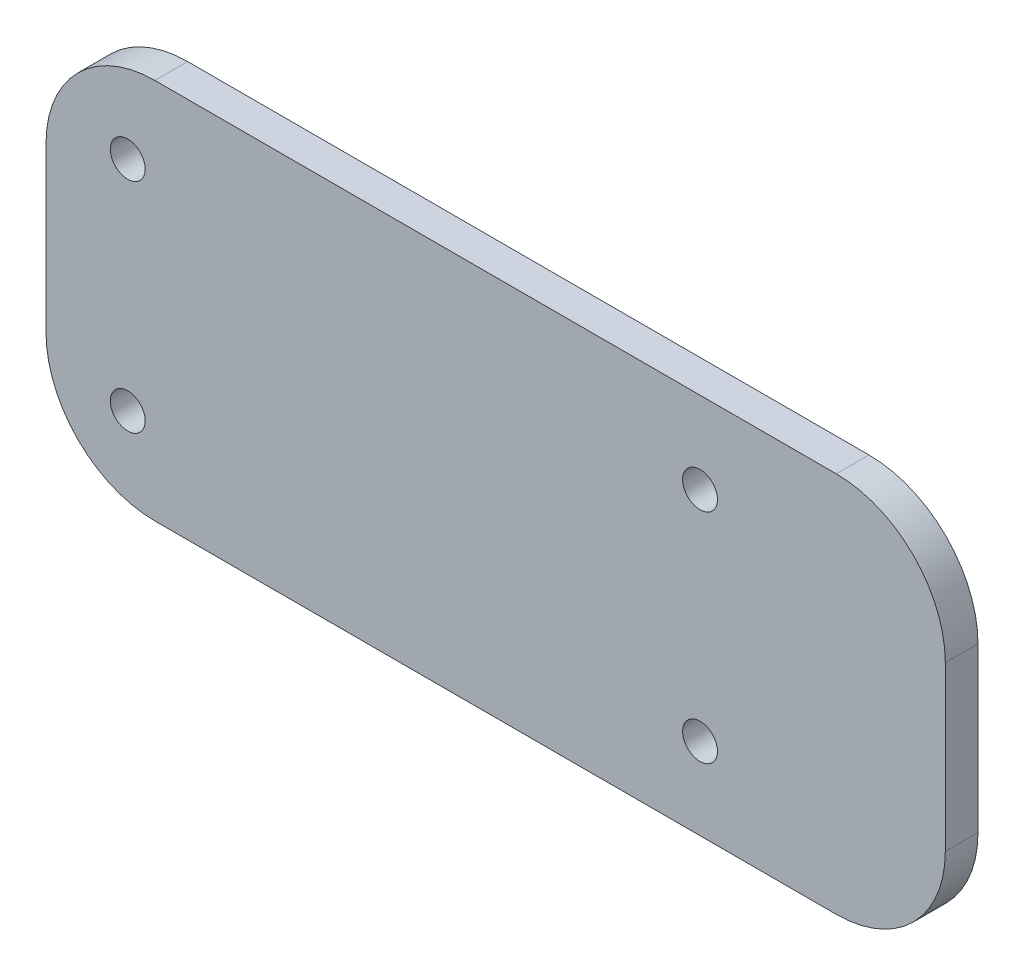
ISO-10303-21;
HEADER;
FILE_DESCRIPTION(('STEP AP214'),'2;1');
FILE_NAME('part.step','',(''),(''),'','','');
FILE_SCHEMA(('AUTOMOTIVE_DESIGN { 1 0 10303 214 1 1 1 1 }'));
ENDSEC;
DATA;
#1=APPLICATION_CONTEXT('core data for automotive mechanical design processes');
#2=APPLICATION_PROTOCOL_DEFINITION('international standard','automotive_design',2000,#1);
#3=PRODUCT_CONTEXT('',#1,'mechanical');
#4=PRODUCT('Part','Part','',(#3));
#5=PRODUCT_RELATED_PRODUCT_CATEGORY('part','',(#4));
#6=PRODUCT_DEFINITION_FORMATION('','',#4);
#7=PRODUCT_DEFINITION_CONTEXT('part definition',#1,'design');
#8=PRODUCT_DEFINITION('design','',#6,#7);
#9=PRODUCT_DEFINITION_SHAPE('','',#8);
#10=(LENGTH_UNIT() NAMED_UNIT(*) SI_UNIT(.MILLI.,.METRE.));
#11=(NAMED_UNIT(*) PLANE_ANGLE_UNIT() SI_UNIT($,.RADIAN.));
#12=(NAMED_UNIT(*) SI_UNIT($,.STERADIAN.) SOLID_ANGLE_UNIT());
#13=UNCERTAINTY_MEASURE_WITH_UNIT(LENGTH_MEASURE(1.E-05),#10,'distance_accuracy_value','');
#14=(GEOMETRIC_REPRESENTATION_CONTEXT(3) GLOBAL_UNCERTAINTY_ASSIGNED_CONTEXT((#13)) GLOBAL_UNIT_ASSIGNED_CONTEXT((#10,
#11,#12)) REPRESENTATION_CONTEXT('',''));
#15=CARTESIAN_POINT('',(0.,0.,0.));
#16=DIRECTION('',(0.,0.,1.));
#17=DIRECTION('',(1.,0.,0.));
#18=AXIS2_PLACEMENT_3D('',#15,#16,#17);
#19=CARTESIAN_POINT('',(0.,0.,3.));
#20=DIRECTION('',(0.,0.,-1.));
#21=DIRECTION('',(-1.,0.,0.));
#22=AXIS2_PLACEMENT_3D('',#19,#20,#21);
#23=PLANE('',#22);
#24=DIRECTION('',(0.,1.,0.));
#25=VECTOR('',#24,1.);
#26=CARTESIAN_POINT('',(48.75,17.5,3.));
#27=LINE('',#26,#25);
#28=CARTESIAN_POINT('',(48.75,-7.5,3.));
#29=VERTEX_POINT('',#28);
#30=CARTESIAN_POINT('',(48.75,7.5,3.));
#31=VERTEX_POINT('',#30);
#32=EDGE_CURVE('E153',#29,#31,#27,.T.);
#33=ORIENTED_EDGE('',*,*,#32,.T.);
#34=CARTESIAN_POINT('',(38.75,7.5,3.));
#35=DIRECTION('',(0.,0.,-1.));
#36=DIRECTION('',(-1.,0.,0.));
#37=AXIS2_PLACEMENT_3D('',#34,#35,#36);
#38=CIRCLE('',#37,10.);
#39=CARTESIAN_POINT('',(38.75,17.5,3.));
#40=VERTEX_POINT('',#39);
#41=EDGE_CURVE('E175',#31,#40,#38,.F.);
#42=ORIENTED_EDGE('',*,*,#41,.T.);
#43=DIRECTION('',(-1.,0.,0.));
#44=VECTOR('',#43,1.);
#45=CARTESIAN_POINT('',(-33.75,17.5,3.));
#46=LINE('',#45,#44);
#47=CARTESIAN_POINT('',(-23.75,17.5,3.));
#48=VERTEX_POINT('',#47);
#49=EDGE_CURVE('E133',#40,#48,#46,.T.);
#50=ORIENTED_EDGE('',*,*,#49,.T.);
#51=CARTESIAN_POINT('',(-23.75,7.5,3.));
#52=DIRECTION('',(0.,0.,-1.));
#53=DIRECTION('',(-1.,0.,0.));
#54=AXIS2_PLACEMENT_3D('',#51,#52,#53);
#55=CIRCLE('',#54,10.);
#56=CARTESIAN_POINT('',(-33.75,7.5,3.));
#57=VERTEX_POINT('',#56);
#58=EDGE_CURVE('E167',#48,#57,#55,.F.);
#59=ORIENTED_EDGE('',*,*,#58,.T.);
#60=DIRECTION('',(0.,-1.,0.));
#61=VECTOR('',#60,1.);
#62=CARTESIAN_POINT('',(-33.75,-17.5,3.));
#63=LINE('',#62,#61);
#64=CARTESIAN_POINT('',(-33.75,-7.50000000000001,3.));
#65=VERTEX_POINT('',#64);
#66=EDGE_CURVE('E146',#57,#65,#63,.T.);
#67=ORIENTED_EDGE('',*,*,#66,.T.);
#68=CARTESIAN_POINT('',(-23.75,-7.50000000000001,3.));
#69=DIRECTION('',(0.,0.,-1.));
#70=DIRECTION('',(-1.,0.,0.));
#71=AXIS2_PLACEMENT_3D('',#68,#69,#70);
#72=CIRCLE('',#71,10.);
#73=CARTESIAN_POINT('',(-23.75,-17.5,3.));
#74=VERTEX_POINT('',#73);
#75=EDGE_CURVE('E68',#65,#74,#72,.F.);
#76=ORIENTED_EDGE('',*,*,#75,.T.);
#77=DIRECTION('',(1.,0.,0.));
#78=VECTOR('',#77,1.);
#79=CARTESIAN_POINT('',(-33.75,-17.5,3.));
#80=LINE('',#79,#78);
#81=CARTESIAN_POINT('',(38.75,-17.5,3.));
#82=VERTEX_POINT('',#81);
#83=EDGE_CURVE('E207',#74,#82,#80,.T.);
#84=ORIENTED_EDGE('',*,*,#83,.T.);
#85=CARTESIAN_POINT('',(38.75,-7.5,3.));
#86=DIRECTION('',(0.,0.,-1.));
#87=DIRECTION('',(-1.,0.,0.));
#88=AXIS2_PLACEMENT_3D('',#85,#86,#87);
#89=CIRCLE('',#88,10.);
#90=EDGE_CURVE('E172',#82,#29,#89,.F.);
#91=ORIENTED_EDGE('',*,*,#90,.T.);
#92=EDGE_LOOP('',(#33,#42,#50,#59,#67,#76,#84,#91));
#93=FACE_BOUND('',#92,.T.);
#94=CARTESIAN_POINT('',(-26.25,10.,3.));
#95=DIRECTION('',(0.,0.,1.));
#96=DIRECTION('',(1.,0.,0.));
#97=AXIS2_PLACEMENT_3D('',#94,#95,#96);
#98=CIRCLE('',#97,1.6);
#99=CARTESIAN_POINT('',(-24.65,10.,3.));
#100=VERTEX_POINT('',#99);
#101=EDGE_CURVE('E196',#100,#100,#98,.T.);
#102=ORIENTED_EDGE('',*,*,#101,.F.);
#103=EDGE_LOOP('',(#102));
#104=FACE_BOUND('',#103,.T.);
#105=CARTESIAN_POINT('',(-26.25,-10.,3.));
#106=DIRECTION('',(0.,0.,1.));
#107=DIRECTION('',(1.,0.,0.));
#108=AXIS2_PLACEMENT_3D('',#105,#106,#107);
#109=CIRCLE('',#108,1.6);
#110=CARTESIAN_POINT('',(-24.65,-10.,3.));
#111=VERTEX_POINT('',#110);
#112=EDGE_CURVE('E214',#111,#111,#109,.T.);
#113=ORIENTED_EDGE('',*,*,#112,.F.);
#114=EDGE_LOOP('',(#113));
#115=FACE_BOUND('',#114,.T.);
#116=CARTESIAN_POINT('',(26.25,-10.,3.));
#117=DIRECTION('',(0.,0.,1.));
#118=DIRECTION('',(1.,0.,0.));
#119=AXIS2_PLACEMENT_3D('',#116,#117,#118);
#120=CIRCLE('',#119,1.6);
#121=CARTESIAN_POINT('',(27.85,-10.,3.));
#122=VERTEX_POINT('',#121);
#123=EDGE_CURVE('E220',#122,#122,#120,.T.);
#124=ORIENTED_EDGE('',*,*,#123,.F.);
#125=EDGE_LOOP('',(#124));
#126=FACE_BOUND('',#125,.T.);
#127=CARTESIAN_POINT('',(26.25,10.,3.));
#128=DIRECTION('',(0.,0.,1.));
#129=DIRECTION('',(1.,0.,0.));
#130=AXIS2_PLACEMENT_3D('',#127,#128,#129);
#131=CIRCLE('',#130,1.6);
#132=CARTESIAN_POINT('',(27.85,10.,3.));
#133=VERTEX_POINT('',#132);
#134=EDGE_CURVE('E228',#133,#133,#131,.T.);
#135=ORIENTED_EDGE('',*,*,#134,.F.);
#136=EDGE_LOOP('',(#135));
#137=FACE_BOUND('',#136,.T.);
#138=ADVANCED_FACE('F45',(#93,#104,#115,#126,#137),#23,.F.);
#139=CARTESIAN_POINT('',(0.,0.,0.));
#140=DIRECTION('',(0.,0.,-1.));
#141=DIRECTION('',(-1.,0.,0.));
#142=AXIS2_PLACEMENT_3D('',#139,#140,#141);
#143=PLANE('',#142);
#144=CARTESIAN_POINT('',(26.25,-10.,0.));
#145=DIRECTION('',(0.,0.,1.));
#146=DIRECTION('',(1.,0.,0.));
#147=AXIS2_PLACEMENT_3D('',#144,#145,#146);
#148=CIRCLE('',#147,1.6);
#149=CARTESIAN_POINT('',(27.85,-10.,0.));
#150=VERTEX_POINT('',#149);
#151=EDGE_CURVE('E224',#150,#150,#148,.T.);
#152=ORIENTED_EDGE('',*,*,#151,.T.);
#153=EDGE_LOOP('',(#152));
#154=FACE_BOUND('',#153,.T.);
#155=CARTESIAN_POINT('',(-26.25,10.,0.));
#156=DIRECTION('',(0.,0.,1.));
#157=DIRECTION('',(1.,0.,0.));
#158=AXIS2_PLACEMENT_3D('',#155,#156,#157);
#159=CIRCLE('',#158,1.6);
#160=CARTESIAN_POINT('',(-24.65,10.,0.));
#161=VERTEX_POINT('',#160);
#162=EDGE_CURVE('E201',#161,#161,#159,.T.);
#163=ORIENTED_EDGE('',*,*,#162,.T.);
#164=EDGE_LOOP('',(#163));
#165=FACE_BOUND('',#164,.T.);
#166=DIRECTION('',(-1.,0.,0.));
#167=VECTOR('',#166,1.);
#168=CARTESIAN_POINT('',(33.75,17.5,0.));
#169=LINE('',#168,#167);
#170=CARTESIAN_POINT('',(38.75,17.5,0.));
#171=VERTEX_POINT('',#170);
#172=CARTESIAN_POINT('',(-23.75,17.5,0.));
#173=VERTEX_POINT('',#172);
#174=EDGE_CURVE('E130',#171,#173,#169,.T.);
#175=ORIENTED_EDGE('',*,*,#174,.F.);
#176=CARTESIAN_POINT('',(38.75,7.5,0.));
#177=DIRECTION('',(0.,0.,-1.));
#178=DIRECTION('',(-1.,0.,0.));
#179=AXIS2_PLACEMENT_3D('',#176,#177,#178);
#180=CIRCLE('',#179,10.);
#181=CARTESIAN_POINT('',(48.75,7.5,0.));
#182=VERTEX_POINT('',#181);
#183=EDGE_CURVE('E112',#171,#182,#180,.T.);
#184=ORIENTED_EDGE('',*,*,#183,.T.);
#185=DIRECTION('',(0.,1.,0.));
#186=VECTOR('',#185,1.);
#187=CARTESIAN_POINT('',(48.75,17.5,0.));
#188=LINE('',#187,#186);
#189=CARTESIAN_POINT('',(48.75,-7.5,0.));
#190=VERTEX_POINT('',#189);
#191=EDGE_CURVE('E142',#190,#182,#188,.T.);
#192=ORIENTED_EDGE('',*,*,#191,.F.);
#193=CARTESIAN_POINT('',(38.75,-7.5,0.));
#194=DIRECTION('',(0.,0.,-1.));
#195=DIRECTION('',(-1.,0.,0.));
#196=AXIS2_PLACEMENT_3D('',#193,#194,#195);
#197=CIRCLE('',#196,10.);
#198=CARTESIAN_POINT('',(38.75,-17.5,0.));
#199=VERTEX_POINT('',#198);
#200=EDGE_CURVE('E124',#190,#199,#197,.T.);
#201=ORIENTED_EDGE('',*,*,#200,.T.);
#202=DIRECTION('',(1.,0.,0.));
#203=VECTOR('',#202,1.);
#204=CARTESIAN_POINT('',(48.75,-17.5,0.));
#205=LINE('',#204,#203);
#206=CARTESIAN_POINT('',(-23.75,-17.5,0.));
#207=VERTEX_POINT('',#206);
#208=EDGE_CURVE('E148',#207,#199,#205,.T.);
#209=ORIENTED_EDGE('',*,*,#208,.F.);
#210=CARTESIAN_POINT('',(-23.75,-7.50000000000001,0.));
#211=DIRECTION('',(0.,0.,-1.));
#212=DIRECTION('',(-1.,0.,0.));
#213=AXIS2_PLACEMENT_3D('',#210,#211,#212);
#214=CIRCLE('',#213,10.);
#215=CARTESIAN_POINT('',(-33.75,-7.50000000000001,0.));
#216=VERTEX_POINT('',#215);
#217=EDGE_CURVE('E157',#207,#216,#214,.T.);
#218=ORIENTED_EDGE('',*,*,#217,.T.);
#219=DIRECTION('',(0.,-1.,0.));
#220=VECTOR('',#219,1.);
#221=CARTESIAN_POINT('',(-33.75,-17.5,0.));
#222=LINE('',#221,#220);
#223=CARTESIAN_POINT('',(-33.75,7.5,0.));
#224=VERTEX_POINT('',#223);
#225=EDGE_CURVE('E190',#224,#216,#222,.T.);
#226=ORIENTED_EDGE('',*,*,#225,.F.);
#227=CARTESIAN_POINT('',(-23.75,7.5,0.));
#228=DIRECTION('',(0.,0.,-1.));
#229=DIRECTION('',(-1.,0.,0.));
#230=AXIS2_PLACEMENT_3D('',#227,#228,#229);
#231=CIRCLE('',#230,10.);
#232=EDGE_CURVE('E135',#224,#173,#231,.T.);
#233=ORIENTED_EDGE('',*,*,#232,.T.);
#234=EDGE_LOOP('',(#175,#184,#192,#201,#209,#218,#226,#233));
#235=FACE_BOUND('',#234,.T.);
#236=CARTESIAN_POINT('',(-26.25,-10.,0.));
#237=DIRECTION('',(0.,0.,1.));
#238=DIRECTION('',(1.,0.,0.));
#239=AXIS2_PLACEMENT_3D('',#236,#237,#238);
#240=CIRCLE('',#239,1.6);
#241=CARTESIAN_POINT('',(-24.65,-10.,0.));
#242=VERTEX_POINT('',#241);
#243=EDGE_CURVE('E216',#242,#242,#240,.T.);
#244=ORIENTED_EDGE('',*,*,#243,.T.);
#245=EDGE_LOOP('',(#244));
#246=FACE_BOUND('',#245,.T.);
#247=CARTESIAN_POINT('',(26.25,10.,0.));
#248=DIRECTION('',(0.,0.,1.));
#249=DIRECTION('',(1.,0.,0.));
#250=AXIS2_PLACEMENT_3D('',#247,#248,#249);
#251=CIRCLE('',#250,1.6);
#252=CARTESIAN_POINT('',(27.85,10.,0.));
#253=VERTEX_POINT('',#252);
#254=EDGE_CURVE('E232',#253,#253,#251,.T.);
#255=ORIENTED_EDGE('',*,*,#254,.T.);
#256=EDGE_LOOP('',(#255));
#257=FACE_BOUND('',#256,.T.);
#258=ADVANCED_FACE('F138',(#154,#165,#235,#246,#257),#143,.T.);
#259=CARTESIAN_POINT('',(-33.75,-17.5,3.));
#260=DIRECTION('',(1.,0.,0.));
#261=DIRECTION('',(0.,0.,-1.));
#262=AXIS2_PLACEMENT_3D('',#259,#260,#261);
#263=PLANE('',#262);
#264=ORIENTED_EDGE('',*,*,#225,.T.);
#265=DIRECTION('',(0.,0.,-1.));
#266=VECTOR('',#265,1.);
#267=CARTESIAN_POINT('',(-33.75,-7.50000000000001,3.));
#268=LINE('',#267,#266);
#269=EDGE_CURVE('E11',#216,#65,#268,.F.);
#270=ORIENTED_EDGE('',*,*,#269,.T.);
#271=ORIENTED_EDGE('',*,*,#66,.F.);
#272=DIRECTION('',(0.,0.,-1.));
#273=VECTOR('',#272,1.);
#274=CARTESIAN_POINT('',(-33.75,7.5,3.));
#275=LINE('',#274,#273);
#276=EDGE_CURVE('E54',#57,#224,#275,.T.);
#277=ORIENTED_EDGE('',*,*,#276,.T.);
#278=EDGE_LOOP('',(#264,#270,#271,#277));
#279=FACE_BOUND('',#278,.T.);
#280=ADVANCED_FACE('F189',(#279),#263,.F.);
#281=CARTESIAN_POINT('',(48.75,-17.5,3.));
#282=DIRECTION('',(0.,1.,0.));
#283=DIRECTION('',(-1.,0.,0.));
#284=AXIS2_PLACEMENT_3D('',#281,#282,#283);
#285=PLANE('',#284);
#286=ORIENTED_EDGE('',*,*,#208,.T.);
#287=DIRECTION('',(0.,0.,-1.));
#288=VECTOR('',#287,1.);
#289=CARTESIAN_POINT('',(38.75,-17.5,3.));
#290=LINE('',#289,#288);
#291=EDGE_CURVE('E61',#199,#82,#290,.F.);
#292=ORIENTED_EDGE('',*,*,#291,.T.);
#293=ORIENTED_EDGE('',*,*,#83,.F.);
#294=DIRECTION('',(0.,0.,-1.));
#295=VECTOR('',#294,1.);
#296=CARTESIAN_POINT('',(-23.75,-17.5,3.));
#297=LINE('',#296,#295);
#298=EDGE_CURVE('E178',#74,#207,#297,.T.);
#299=ORIENTED_EDGE('',*,*,#298,.T.);
#300=EDGE_LOOP('',(#286,#292,#293,#299));
#301=FACE_BOUND('',#300,.T.);
#302=ADVANCED_FACE('F261',(#301),#285,.F.);
#303=CARTESIAN_POINT('',(48.75,17.5,3.));
#304=DIRECTION('',(-1.,0.,0.));
#305=DIRECTION('',(0.,-1.,0.));
#306=AXIS2_PLACEMENT_3D('',#303,#304,#305);
#307=PLANE('',#306);
#308=ORIENTED_EDGE('',*,*,#191,.T.);
#309=DIRECTION('',(0.,0.,-1.));
#310=VECTOR('',#309,1.);
#311=CARTESIAN_POINT('',(48.75,7.5,3.));
#312=LINE('',#311,#310);
#313=EDGE_CURVE('E117',#182,#31,#312,.F.);
#314=ORIENTED_EDGE('',*,*,#313,.T.);
#315=ORIENTED_EDGE('',*,*,#32,.F.);
#316=DIRECTION('',(0.,0.,-1.));
#317=VECTOR('',#316,1.);
#318=CARTESIAN_POINT('',(48.75,-7.5,3.));
#319=LINE('',#318,#317);
#320=EDGE_CURVE('E123',#29,#190,#319,.T.);
#321=ORIENTED_EDGE('',*,*,#320,.T.);
#322=EDGE_LOOP('',(#308,#314,#315,#321));
#323=FACE_BOUND('',#322,.T.);
#324=ADVANCED_FACE('F258',(#323),#307,.F.);
#325=CARTESIAN_POINT('',(33.75,17.5,3.));
#326=DIRECTION('',(0.,-1.,0.));
#327=DIRECTION('',(0.,0.,-1.));
#328=AXIS2_PLACEMENT_3D('',#325,#326,#327);
#329=PLANE('',#328);
#330=ORIENTED_EDGE('',*,*,#49,.F.);
#331=DIRECTION('',(0.,0.,-1.));
#332=VECTOR('',#331,1.);
#333=CARTESIAN_POINT('',(38.75,17.5,3.));
#334=LINE('',#333,#332);
#335=EDGE_CURVE('E116',#40,#171,#334,.T.);
#336=ORIENTED_EDGE('',*,*,#335,.T.);
#337=ORIENTED_EDGE('',*,*,#174,.T.);
#338=DIRECTION('',(0.,0.,-1.));
#339=VECTOR('',#338,1.);
#340=CARTESIAN_POINT('',(-23.75,17.5,3.));
#341=LINE('',#340,#339);
#342=EDGE_CURVE('E136',#173,#48,#341,.F.);
#343=ORIENTED_EDGE('',*,*,#342,.T.);
#344=EDGE_LOOP('',(#330,#336,#337,#343));
#345=FACE_BOUND('',#344,.T.);
#346=ADVANCED_FACE('F129',(#345),#329,.F.);
#347=CARTESIAN_POINT('',(-26.25,10.,3.));
#348=DIRECTION('',(0.,0.,-1.));
#349=DIRECTION('',(-1.,0.,0.));
#350=AXIS2_PLACEMENT_3D('',#347,#348,#349);
#351=CYLINDRICAL_SURFACE('',#350,1.6);
#352=ORIENTED_EDGE('',*,*,#101,.T.);
#353=EDGE_LOOP('',(#352));
#354=FACE_BOUND('',#353,.T.);
#355=ORIENTED_EDGE('',*,*,#162,.F.);
#356=EDGE_LOOP('',(#355));
#357=FACE_BOUND('',#356,.T.);
#358=ADVANCED_FACE('F253',(#354,#357),#351,.F.);
#359=CARTESIAN_POINT('',(-26.25,-10.,3.));
#360=DIRECTION('',(0.,0.,-1.));
#361=DIRECTION('',(-1.,0.,0.));
#362=AXIS2_PLACEMENT_3D('',#359,#360,#361);
#363=CYLINDRICAL_SURFACE('',#362,1.6);
#364=ORIENTED_EDGE('',*,*,#112,.T.);
#365=EDGE_LOOP('',(#364));
#366=FACE_BOUND('',#365,.T.);
#367=ORIENTED_EDGE('',*,*,#243,.F.);
#368=EDGE_LOOP('',(#367));
#369=FACE_BOUND('',#368,.T.);
#370=ADVANCED_FACE('F318',(#366,#369),#363,.F.);
#371=CARTESIAN_POINT('',(26.25,-10.,3.));
#372=DIRECTION('',(0.,0.,-1.));
#373=DIRECTION('',(-1.,0.,0.));
#374=AXIS2_PLACEMENT_3D('',#371,#372,#373);
#375=CYLINDRICAL_SURFACE('',#374,1.6);
#376=ORIENTED_EDGE('',*,*,#123,.T.);
#377=EDGE_LOOP('',(#376));
#378=FACE_BOUND('',#377,.T.);
#379=ORIENTED_EDGE('',*,*,#151,.F.);
#380=EDGE_LOOP('',(#379));
#381=FACE_BOUND('',#380,.T.);
#382=ADVANCED_FACE('F309',(#378,#381),#375,.F.);
#383=CARTESIAN_POINT('',(26.25,10.,3.));
#384=DIRECTION('',(0.,0.,-1.));
#385=DIRECTION('',(-1.,0.,0.));
#386=AXIS2_PLACEMENT_3D('',#383,#384,#385);
#387=CYLINDRICAL_SURFACE('',#386,1.6);
#388=ORIENTED_EDGE('',*,*,#134,.T.);
#389=EDGE_LOOP('',(#388));
#390=FACE_BOUND('',#389,.T.);
#391=ORIENTED_EDGE('',*,*,#254,.F.);
#392=EDGE_LOOP('',(#391));
#393=FACE_BOUND('',#392,.T.);
#394=ADVANCED_FACE('F240',(#390,#393),#387,.F.);
#395=CARTESIAN_POINT('',(38.75,7.5,3.));
#396=DIRECTION('',(0.,0.,-1.));
#397=DIRECTION('',(-1.,0.,0.));
#398=AXIS2_PLACEMENT_3D('',#395,#396,#397);
#399=CYLINDRICAL_SURFACE('',#398,10.);
#400=ORIENTED_EDGE('',*,*,#41,.F.);
#401=ORIENTED_EDGE('',*,*,#313,.F.);
#402=ORIENTED_EDGE('',*,*,#183,.F.);
#403=ORIENTED_EDGE('',*,*,#335,.F.);
#404=EDGE_LOOP('',(#400,#401,#402,#403));
#405=FACE_BOUND('',#404,.T.);
#406=ADVANCED_FACE('F115',(#405),#399,.T.);
#407=CARTESIAN_POINT('',(38.75,-7.5,3.));
#408=DIRECTION('',(0.,0.,-1.));
#409=DIRECTION('',(-1.,0.,0.));
#410=AXIS2_PLACEMENT_3D('',#407,#408,#409);
#411=CYLINDRICAL_SURFACE('',#410,10.);
#412=ORIENTED_EDGE('',*,*,#90,.F.);
#413=ORIENTED_EDGE('',*,*,#291,.F.);
#414=ORIENTED_EDGE('',*,*,#200,.F.);
#415=ORIENTED_EDGE('',*,*,#320,.F.);
#416=EDGE_LOOP('',(#412,#413,#414,#415));
#417=FACE_BOUND('',#416,.T.);
#418=ADVANCED_FACE('F269',(#417),#411,.T.);
#419=CARTESIAN_POINT('',(-23.75,-7.50000000000001,3.));
#420=DIRECTION('',(0.,0.,-1.));
#421=DIRECTION('',(-1.,0.,0.));
#422=AXIS2_PLACEMENT_3D('',#419,#420,#421);
#423=CYLINDRICAL_SURFACE('',#422,10.);
#424=ORIENTED_EDGE('',*,*,#75,.F.);
#425=ORIENTED_EDGE('',*,*,#269,.F.);
#426=ORIENTED_EDGE('',*,*,#217,.F.);
#427=ORIENTED_EDGE('',*,*,#298,.F.);
#428=EDGE_LOOP('',(#424,#425,#426,#427));
#429=FACE_BOUND('',#428,.T.);
#430=ADVANCED_FACE('F271',(#429),#423,.T.);
#431=CARTESIAN_POINT('',(-23.75,7.5,3.));
#432=DIRECTION('',(0.,0.,-1.));
#433=DIRECTION('',(-1.,0.,0.));
#434=AXIS2_PLACEMENT_3D('',#431,#432,#433);
#435=CYLINDRICAL_SURFACE('',#434,10.);
#436=ORIENTED_EDGE('',*,*,#58,.F.);
#437=ORIENTED_EDGE('',*,*,#342,.F.);
#438=ORIENTED_EDGE('',*,*,#232,.F.);
#439=ORIENTED_EDGE('',*,*,#276,.F.);
#440=EDGE_LOOP('',(#436,#437,#438,#439));
#441=FACE_BOUND('',#440,.T.);
#442=ADVANCED_FACE('F47',(#441),#435,.T.);
#443=CLOSED_SHELL('',(#138,#258,#280,#302,#324,#346,#358,#370,#382,#394,#406,#418,#430,#442));
#444=MANIFOLD_SOLID_BREP('B2',#443);
#445=ADVANCED_BREP_SHAPE_REPRESENTATION('',(#18,#444),#14);
#446=SHAPE_DEFINITION_REPRESENTATION(#9,#445);
ENDSEC;
END-ISO-10303-21;
